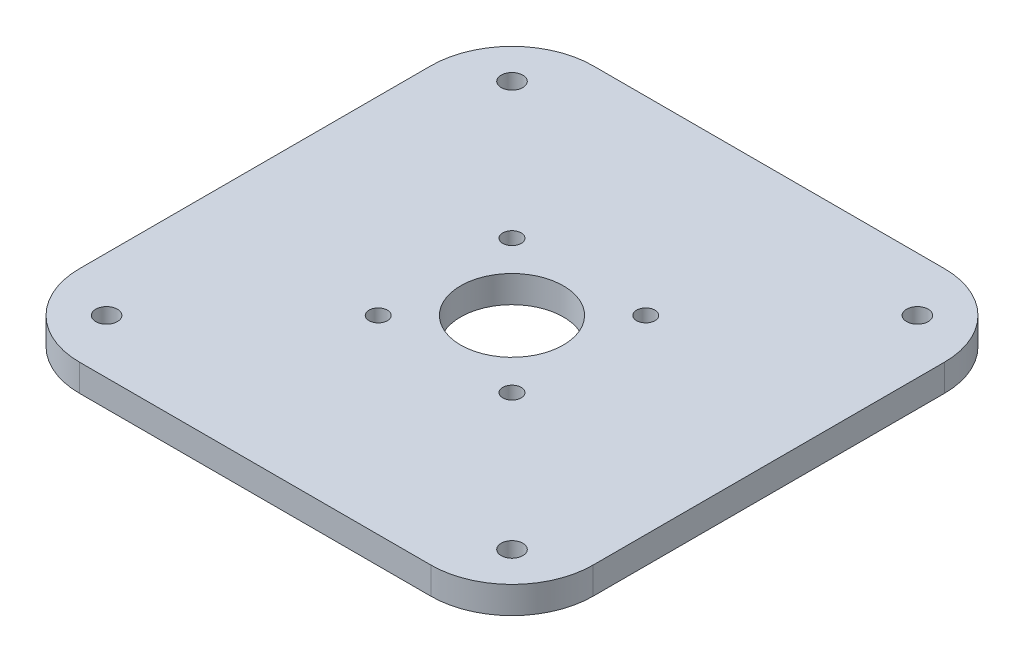
ISO-10303-21;
HEADER;
FILE_DESCRIPTION(('STEP AP214'),'2;1');
FILE_NAME('part.step','',(''),(''),'','','');
FILE_SCHEMA(('AUTOMOTIVE_DESIGN { 1 0 10303 214 1 1 1 1 }'));
ENDSEC;
DATA;
#1=APPLICATION_CONTEXT('core data for automotive mechanical design processes');
#2=APPLICATION_PROTOCOL_DEFINITION('international standard','automotive_design',2000,#1);
#3=PRODUCT_CONTEXT('',#1,'mechanical');
#4=PRODUCT('Part','Part','',(#3));
#5=PRODUCT_RELATED_PRODUCT_CATEGORY('part','',(#4));
#6=PRODUCT_DEFINITION_FORMATION('','',#4);
#7=PRODUCT_DEFINITION_CONTEXT('part definition',#1,'design');
#8=PRODUCT_DEFINITION('design','',#6,#7);
#9=PRODUCT_DEFINITION_SHAPE('','',#8);
#10=(LENGTH_UNIT() NAMED_UNIT(*) SI_UNIT(.MILLI.,.METRE.));
#11=(NAMED_UNIT(*) PLANE_ANGLE_UNIT() SI_UNIT($,.RADIAN.));
#12=(NAMED_UNIT(*) SI_UNIT($,.STERADIAN.) SOLID_ANGLE_UNIT());
#13=UNCERTAINTY_MEASURE_WITH_UNIT(LENGTH_MEASURE(1.E-05),#10,'distance_accuracy_value','');
#14=(GEOMETRIC_REPRESENTATION_CONTEXT(3) GLOBAL_UNCERTAINTY_ASSIGNED_CONTEXT((#13)) GLOBAL_UNIT_ASSIGNED_CONTEXT((#10,
#11,#12)) REPRESENTATION_CONTEXT('',''));
#15=CARTESIAN_POINT('',(0.,0.,0.));
#16=DIRECTION('',(0.,0.,1.));
#17=DIRECTION('',(1.,0.,0.));
#18=AXIS2_PLACEMENT_3D('',#15,#16,#17);
#19=CARTESIAN_POINT('',(-95.,10.,95.));
#20=DIRECTION('',(1.,0.,0.));
#21=DIRECTION('',(0.,0.,-1.));
#22=AXIS2_PLACEMENT_3D('',#19,#20,#21);
#23=PLANE('',#22);
#24=DIRECTION('',(0.,0.,1.));
#25=VECTOR('',#24,1.);
#26=CARTESIAN_POINT('',(-95.,0.,95.));
#27=LINE('',#26,#25);
#28=CARTESIAN_POINT('',(-95.,0.,-65.));
#29=VERTEX_POINT('',#28);
#30=CARTESIAN_POINT('',(-95.,0.,65.));
#31=VERTEX_POINT('',#30);
#32=EDGE_CURVE('E130',#29,#31,#27,.T.);
#33=ORIENTED_EDGE('',*,*,#32,.T.);
#34=DIRECTION('',(0.,-1.,0.));
#35=VECTOR('',#34,1.);
#36=CARTESIAN_POINT('',(-95.,10.,65.));
#37=LINE('',#36,#35);
#38=CARTESIAN_POINT('',(-95.,10.,65.));
#39=VERTEX_POINT('',#38);
#40=EDGE_CURVE('E108',#31,#39,#37,.F.);
#41=ORIENTED_EDGE('',*,*,#40,.T.);
#42=DIRECTION('',(0.,0.,1.));
#43=VECTOR('',#42,1.);
#44=CARTESIAN_POINT('',(-95.,10.,95.));
#45=LINE('',#44,#43);
#46=CARTESIAN_POINT('',(-95.,10.,-65.));
#47=VERTEX_POINT('',#46);
#48=EDGE_CURVE('E140',#47,#39,#45,.T.);
#49=ORIENTED_EDGE('',*,*,#48,.F.);
#50=DIRECTION('',(0.,-1.,0.));
#51=VECTOR('',#50,1.);
#52=CARTESIAN_POINT('',(-95.,10.,-65.));
#53=LINE('',#52,#51);
#54=EDGE_CURVE('E113',#47,#29,#53,.T.);
#55=ORIENTED_EDGE('',*,*,#54,.T.);
#56=EDGE_LOOP('',(#33,#41,#49,#55));
#57=FACE_BOUND('',#56,.T.);
#58=ADVANCED_FACE('F35',(#57),#23,.F.);
#59=CARTESIAN_POINT('',(95.,10.,94.9999999999999));
#60=DIRECTION('',(0.,0.,-1.));
#61=DIRECTION('',(-1.,0.,0.));
#62=AXIS2_PLACEMENT_3D('',#59,#60,#61);
#63=PLANE('',#62);
#64=DIRECTION('',(1.,0.,0.));
#65=VECTOR('',#64,1.);
#66=CARTESIAN_POINT('',(95.,10.,94.9999999999999));
#67=LINE('',#66,#65);
#68=CARTESIAN_POINT('',(-65.,10.,95.));
#69=VERTEX_POINT('',#68);
#70=CARTESIAN_POINT('',(65.,10.,94.9999999999999));
#71=VERTEX_POINT('',#70);
#72=EDGE_CURVE('E123',#69,#71,#67,.T.);
#73=ORIENTED_EDGE('',*,*,#72,.F.);
#74=DIRECTION('',(0.,-1.,0.));
#75=VECTOR('',#74,1.);
#76=CARTESIAN_POINT('',(-65.,10.,95.));
#77=LINE('',#76,#75);
#78=CARTESIAN_POINT('',(-65.,0.,95.));
#79=VERTEX_POINT('',#78);
#80=EDGE_CURVE('E107',#69,#79,#77,.T.);
#81=ORIENTED_EDGE('',*,*,#80,.T.);
#82=DIRECTION('',(1.,0.,0.));
#83=VECTOR('',#82,1.);
#84=CARTESIAN_POINT('',(95.,0.,94.9999999999999));
#85=LINE('',#84,#83);
#86=CARTESIAN_POINT('',(65.,0.,94.9999999999999));
#87=VERTEX_POINT('',#86);
#88=EDGE_CURVE('E120',#79,#87,#85,.T.);
#89=ORIENTED_EDGE('',*,*,#88,.T.);
#90=DIRECTION('',(0.,-1.,0.));
#91=VECTOR('',#90,1.);
#92=CARTESIAN_POINT('',(65.,10.,94.9999999999999));
#93=LINE('',#92,#91);
#94=EDGE_CURVE('E125',#87,#71,#93,.F.);
#95=ORIENTED_EDGE('',*,*,#94,.T.);
#96=EDGE_LOOP('',(#73,#81,#89,#95));
#97=FACE_BOUND('',#96,.T.);
#98=ADVANCED_FACE('F119',(#97),#63,.F.);
#99=CARTESIAN_POINT('',(95.,10.,94.9999999999999));
#100=DIRECTION('',(-1.,0.,0.));
#101=DIRECTION('',(0.,0.,1.));
#102=AXIS2_PLACEMENT_3D('',#99,#100,#101);
#103=PLANE('',#102);
#104=DIRECTION('',(0.,0.,-1.));
#105=VECTOR('',#104,1.);
#106=CARTESIAN_POINT('',(95.,10.,94.9999999999999));
#107=LINE('',#106,#105);
#108=CARTESIAN_POINT('',(95.,10.,64.9999999999999));
#109=VERTEX_POINT('',#108);
#110=CARTESIAN_POINT('',(95.,10.,-65.0000000000001));
#111=VERTEX_POINT('',#110);
#112=EDGE_CURVE('E219',#109,#111,#107,.T.);
#113=ORIENTED_EDGE('',*,*,#112,.F.);
#114=DIRECTION('',(0.,-1.,0.));
#115=VECTOR('',#114,1.);
#116=CARTESIAN_POINT('',(95.,10.,64.9999999999999));
#117=LINE('',#116,#115);
#118=CARTESIAN_POINT('',(95.,0.,64.9999999999999));
#119=VERTEX_POINT('',#118);
#120=EDGE_CURVE('E159',#109,#119,#117,.T.);
#121=ORIENTED_EDGE('',*,*,#120,.T.);
#122=DIRECTION('',(0.,0.,-1.));
#123=VECTOR('',#122,1.);
#124=CARTESIAN_POINT('',(95.,0.,94.9999999999999));
#125=LINE('',#124,#123);
#126=CARTESIAN_POINT('',(95.,0.,-65.0000000000001));
#127=VERTEX_POINT('',#126);
#128=EDGE_CURVE('E129',#119,#127,#125,.T.);
#129=ORIENTED_EDGE('',*,*,#128,.T.);
#130=DIRECTION('',(0.,-1.,0.));
#131=VECTOR('',#130,1.);
#132=CARTESIAN_POINT('',(95.,10.,-65.0000000000001));
#133=LINE('',#132,#131);
#134=EDGE_CURVE('E157',#127,#111,#133,.F.);
#135=ORIENTED_EDGE('',*,*,#134,.T.);
#136=EDGE_LOOP('',(#113,#121,#129,#135));
#137=FACE_BOUND('',#136,.T.);
#138=ADVANCED_FACE('F234',(#137),#103,.F.);
#139=CARTESIAN_POINT('',(95.,10.,-95.0000000000001));
#140=DIRECTION('',(0.,0.,1.));
#141=DIRECTION('',(1.,0.,0.));
#142=AXIS2_PLACEMENT_3D('',#139,#140,#141);
#143=PLANE('',#142);
#144=DIRECTION('',(-1.,0.,0.));
#145=VECTOR('',#144,1.);
#146=CARTESIAN_POINT('',(95.,10.,-95.0000000000001));
#147=LINE('',#146,#145);
#148=CARTESIAN_POINT('',(65.,10.,-95.0000000000001));
#149=VERTEX_POINT('',#148);
#150=CARTESIAN_POINT('',(-65.,10.,-95.));
#151=VERTEX_POINT('',#150);
#152=EDGE_CURVE('E141',#149,#151,#147,.T.);
#153=ORIENTED_EDGE('',*,*,#152,.F.);
#154=DIRECTION('',(0.,-1.,0.));
#155=VECTOR('',#154,1.);
#156=CARTESIAN_POINT('',(65.,10.,-95.0000000000001));
#157=LINE('',#156,#155);
#158=CARTESIAN_POINT('',(65.,0.,-95.0000000000001));
#159=VERTEX_POINT('',#158);
#160=EDGE_CURVE('E11',#149,#159,#157,.T.);
#161=ORIENTED_EDGE('',*,*,#160,.T.);
#162=DIRECTION('',(-1.,0.,0.));
#163=VECTOR('',#162,1.);
#164=CARTESIAN_POINT('',(95.,0.,-95.0000000000001));
#165=LINE('',#164,#163);
#166=CARTESIAN_POINT('',(-65.,0.,-95.));
#167=VERTEX_POINT('',#166);
#168=EDGE_CURVE('E133',#159,#167,#165,.T.);
#169=ORIENTED_EDGE('',*,*,#168,.T.);
#170=DIRECTION('',(0.,-1.,0.));
#171=VECTOR('',#170,1.);
#172=CARTESIAN_POINT('',(-65.,10.,-95.));
#173=LINE('',#172,#171);
#174=EDGE_CURVE('E44',#167,#151,#173,.F.);
#175=ORIENTED_EDGE('',*,*,#174,.T.);
#176=EDGE_LOOP('',(#153,#161,#169,#175));
#177=FACE_BOUND('',#176,.T.);
#178=ADVANCED_FACE('F228',(#177),#143,.F.);
#179=CARTESIAN_POINT('',(0.,10.,0.));
#180=DIRECTION('',(0.,1.,0.));
#181=DIRECTION('',(0.,0.,1.));
#182=AXIS2_PLACEMENT_3D('',#179,#180,#181);
#183=PLANE('',#182);
#184=CARTESIAN_POINT('',(-24.7487373415292,10.,-24.7487373415292));
#185=DIRECTION('',(0.,1.,0.));
#186=DIRECTION('',(0.,0.,1.));
#187=AXIS2_PLACEMENT_3D('',#184,#185,#186);
#188=CIRCLE('',#187,3.39999999999999);
#189=CARTESIAN_POINT('',(-24.7487373415292,10.,-21.3487373415292));
#190=VERTEX_POINT('',#189);
#191=EDGE_CURVE('E179',#190,#190,#188,.T.);
#192=ORIENTED_EDGE('',*,*,#191,.F.);
#193=EDGE_LOOP('',(#192));
#194=FACE_BOUND('',#193,.T.);
#195=CARTESIAN_POINT('',(24.7487373415292,10.,-24.7487373415292));
#196=DIRECTION('',(0.,1.,0.));
#197=DIRECTION('',(0.,0.,1.));
#198=AXIS2_PLACEMENT_3D('',#195,#196,#197);
#199=CIRCLE('',#198,3.39999999999999);
#200=CARTESIAN_POINT('',(24.7487373415292,10.,-21.3487373415292));
#201=VERTEX_POINT('',#200);
#202=EDGE_CURVE('E169',#201,#201,#199,.T.);
#203=ORIENTED_EDGE('',*,*,#202,.F.);
#204=EDGE_LOOP('',(#203));
#205=FACE_BOUND('',#204,.T.);
#206=CARTESIAN_POINT('',(-24.7487373415292,10.,24.7487373415292));
#207=DIRECTION('',(0.,1.,0.));
#208=DIRECTION('',(0.,0.,1.));
#209=AXIS2_PLACEMENT_3D('',#206,#207,#208);
#210=CIRCLE('',#209,3.39999999999999);
#211=CARTESIAN_POINT('',(-24.7487373415292,10.,28.1487373415291));
#212=VERTEX_POINT('',#211);
#213=EDGE_CURVE('E166',#212,#212,#210,.T.);
#214=ORIENTED_EDGE('',*,*,#213,.F.);
#215=EDGE_LOOP('',(#214));
#216=FACE_BOUND('',#215,.T.);
#217=CARTESIAN_POINT('',(24.7487373415292,10.,24.7487373415292));
#218=DIRECTION('',(0.,1.,0.));
#219=DIRECTION('',(0.,0.,1.));
#220=AXIS2_PLACEMENT_3D('',#217,#218,#219);
#221=CIRCLE('',#220,3.39999999999999);
#222=CARTESIAN_POINT('',(24.7487373415292,10.,28.1487373415291));
#223=VERTEX_POINT('',#222);
#224=EDGE_CURVE('E165',#223,#223,#221,.T.);
#225=ORIENTED_EDGE('',*,*,#224,.F.);
#226=EDGE_LOOP('',(#225));
#227=FACE_BOUND('',#226,.T.);
#228=CARTESIAN_POINT('',(-75.,10.,75.));
#229=DIRECTION('',(0.,1.,0.));
#230=DIRECTION('',(0.,0.,-1.));
#231=AXIS2_PLACEMENT_3D('',#228,#229,#230);
#232=CIRCLE('',#231,4.00000000000001);
#233=CARTESIAN_POINT('',(-75.,10.,71.));
#234=VERTEX_POINT('',#233);
#235=EDGE_CURVE('E187',#234,#234,#232,.T.);
#236=ORIENTED_EDGE('',*,*,#235,.F.);
#237=EDGE_LOOP('',(#236));
#238=FACE_BOUND('',#237,.T.);
#239=CARTESIAN_POINT('',(75.,10.,75.));
#240=DIRECTION('',(0.,1.,0.));
#241=DIRECTION('',(0.,0.,1.));
#242=AXIS2_PLACEMENT_3D('',#239,#240,#241);
#243=CIRCLE('',#242,4.00000000000001);
#244=CARTESIAN_POINT('',(75.,10.,79.));
#245=VERTEX_POINT('',#244);
#246=EDGE_CURVE('E204',#245,#245,#243,.T.);
#247=ORIENTED_EDGE('',*,*,#246,.F.);
#248=EDGE_LOOP('',(#247));
#249=FACE_BOUND('',#248,.T.);
#250=CARTESIAN_POINT('',(75.,10.,-75.));
#251=DIRECTION('',(0.,1.,0.));
#252=DIRECTION('',(0.,0.,-1.));
#253=AXIS2_PLACEMENT_3D('',#250,#251,#252);
#254=CIRCLE('',#253,4.00000000000001);
#255=CARTESIAN_POINT('',(75.,10.,-79.));
#256=VERTEX_POINT('',#255);
#257=EDGE_CURVE('E198',#256,#256,#254,.T.);
#258=ORIENTED_EDGE('',*,*,#257,.F.);
#259=EDGE_LOOP('',(#258));
#260=FACE_BOUND('',#259,.T.);
#261=CARTESIAN_POINT('',(-75.,10.,-75.));
#262=DIRECTION('',(0.,1.,0.));
#263=DIRECTION('',(0.,0.,1.));
#264=AXIS2_PLACEMENT_3D('',#261,#262,#263);
#265=CIRCLE('',#264,4.00000000000001);
#266=CARTESIAN_POINT('',(-75.,10.,-71.));
#267=VERTEX_POINT('',#266);
#268=EDGE_CURVE('E192',#267,#267,#265,.T.);
#269=ORIENTED_EDGE('',*,*,#268,.F.);
#270=EDGE_LOOP('',(#269));
#271=FACE_BOUND('',#270,.T.);
#272=CARTESIAN_POINT('',(0.,10.,0.));
#273=DIRECTION('',(0.,1.,0.));
#274=DIRECTION('',(0.,0.,1.));
#275=AXIS2_PLACEMENT_3D('',#272,#273,#274);
#276=CIRCLE('',#275,19.);
#277=CARTESIAN_POINT('',(0.,10.,19.));
#278=VERTEX_POINT('',#277);
#279=EDGE_CURVE('E191',#278,#278,#276,.T.);
#280=ORIENTED_EDGE('',*,*,#279,.F.);
#281=EDGE_LOOP('',(#280));
#282=FACE_BOUND('',#281,.T.);
#283=ORIENTED_EDGE('',*,*,#48,.T.);
#284=CARTESIAN_POINT('',(-65.,10.,65.));
#285=DIRECTION('',(0.,1.,0.));
#286=DIRECTION('',(0.,0.,1.));
#287=AXIS2_PLACEMENT_3D('',#284,#285,#286);
#288=CIRCLE('',#287,30.);
#289=EDGE_CURVE('E155',#39,#69,#288,.T.);
#290=ORIENTED_EDGE('',*,*,#289,.T.);
#291=ORIENTED_EDGE('',*,*,#72,.T.);
#292=CARTESIAN_POINT('',(65.,10.,64.9999999999999));
#293=DIRECTION('',(0.,1.,0.));
#294=DIRECTION('',(0.,0.,1.));
#295=AXIS2_PLACEMENT_3D('',#292,#293,#294);
#296=CIRCLE('',#295,30.);
#297=EDGE_CURVE('E153',#71,#109,#296,.T.);
#298=ORIENTED_EDGE('',*,*,#297,.T.);
#299=ORIENTED_EDGE('',*,*,#112,.T.);
#300=CARTESIAN_POINT('',(65.,10.,-65.0000000000001));
#301=DIRECTION('',(0.,1.,0.));
#302=DIRECTION('',(0.,0.,1.));
#303=AXIS2_PLACEMENT_3D('',#300,#301,#302);
#304=CIRCLE('',#303,30.);
#305=EDGE_CURVE('E58',#111,#149,#304,.T.);
#306=ORIENTED_EDGE('',*,*,#305,.T.);
#307=ORIENTED_EDGE('',*,*,#152,.T.);
#308=CARTESIAN_POINT('',(-65.,10.,-65.));
#309=DIRECTION('',(0.,1.,0.));
#310=DIRECTION('',(0.,0.,1.));
#311=AXIS2_PLACEMENT_3D('',#308,#309,#310);
#312=CIRCLE('',#311,30.);
#313=EDGE_CURVE('E150',#151,#47,#312,.T.);
#314=ORIENTED_EDGE('',*,*,#313,.T.);
#315=EDGE_LOOP('',(#283,#290,#291,#298,#299,#306,#307,#314));
#316=FACE_BOUND('',#315,.T.);
#317=ADVANCED_FACE('F221',(#194,#205,#216,#227,#238,#249,#260,#271,#282,#316),#183,.T.);
#318=CARTESIAN_POINT('',(0.,0.,0.));
#319=DIRECTION('',(0.,1.,0.));
#320=DIRECTION('',(0.,0.,1.));
#321=AXIS2_PLACEMENT_3D('',#318,#319,#320);
#322=PLANE('',#321);
#323=CARTESIAN_POINT('',(-24.7487373415292,0.,-24.7487373415292));
#324=DIRECTION('',(0.,1.,0.));
#325=DIRECTION('',(0.,0.,1.));
#326=AXIS2_PLACEMENT_3D('',#323,#324,#325);
#327=CIRCLE('',#326,3.39999999999999);
#328=CARTESIAN_POINT('',(-24.7487373415292,0.,-21.3487373415292));
#329=VERTEX_POINT('',#328);
#330=EDGE_CURVE('E39',#329,#329,#327,.T.);
#331=ORIENTED_EDGE('',*,*,#330,.T.);
#332=EDGE_LOOP('',(#331));
#333=FACE_BOUND('',#332,.T.);
#334=CARTESIAN_POINT('',(24.7487373415292,0.,-24.7487373415292));
#335=DIRECTION('',(0.,1.,0.));
#336=DIRECTION('',(0.,0.,1.));
#337=AXIS2_PLACEMENT_3D('',#334,#335,#336);
#338=CIRCLE('',#337,3.39999999999999);
#339=CARTESIAN_POINT('',(24.7487373415292,0.,-21.3487373415292));
#340=VERTEX_POINT('',#339);
#341=EDGE_CURVE('E167',#340,#340,#338,.T.);
#342=ORIENTED_EDGE('',*,*,#341,.T.);
#343=EDGE_LOOP('',(#342));
#344=FACE_BOUND('',#343,.T.);
#345=CARTESIAN_POINT('',(-24.7487373415292,0.,24.7487373415292));
#346=DIRECTION('',(0.,1.,0.));
#347=DIRECTION('',(0.,0.,1.));
#348=AXIS2_PLACEMENT_3D('',#345,#346,#347);
#349=CIRCLE('',#348,3.39999999999999);
#350=CARTESIAN_POINT('',(-24.7487373415292,0.,28.1487373415291));
#351=VERTEX_POINT('',#350);
#352=EDGE_CURVE('E163',#351,#351,#349,.T.);
#353=ORIENTED_EDGE('',*,*,#352,.T.);
#354=EDGE_LOOP('',(#353));
#355=FACE_BOUND('',#354,.T.);
#356=CARTESIAN_POINT('',(24.7487373415292,0.,24.7487373415292));
#357=DIRECTION('',(0.,1.,0.));
#358=DIRECTION('',(0.,0.,1.));
#359=AXIS2_PLACEMENT_3D('',#356,#357,#358);
#360=CIRCLE('',#359,3.39999999999999);
#361=CARTESIAN_POINT('',(24.7487373415292,0.,28.1487373415291));
#362=VERTEX_POINT('',#361);
#363=EDGE_CURVE('E184',#362,#362,#360,.T.);
#364=ORIENTED_EDGE('',*,*,#363,.T.);
#365=EDGE_LOOP('',(#364));
#366=FACE_BOUND('',#365,.T.);
#367=CARTESIAN_POINT('',(-75.,0.,75.));
#368=DIRECTION('',(0.,1.,0.));
#369=DIRECTION('',(0.,0.,-1.));
#370=AXIS2_PLACEMENT_3D('',#367,#368,#369);
#371=CIRCLE('',#370,4.00000000000001);
#372=CARTESIAN_POINT('',(-75.,0.,71.));
#373=VERTEX_POINT('',#372);
#374=EDGE_CURVE('E207',#373,#373,#371,.T.);
#375=ORIENTED_EDGE('',*,*,#374,.T.);
#376=EDGE_LOOP('',(#375));
#377=FACE_BOUND('',#376,.T.);
#378=CARTESIAN_POINT('',(75.,0.,75.));
#379=DIRECTION('',(0.,1.,0.));
#380=DIRECTION('',(0.,0.,1.));
#381=AXIS2_PLACEMENT_3D('',#378,#379,#380);
#382=CIRCLE('',#381,4.00000000000001);
#383=CARTESIAN_POINT('',(75.,0.,79.));
#384=VERTEX_POINT('',#383);
#385=EDGE_CURVE('E201',#384,#384,#382,.T.);
#386=ORIENTED_EDGE('',*,*,#385,.T.);
#387=EDGE_LOOP('',(#386));
#388=FACE_BOUND('',#387,.T.);
#389=CARTESIAN_POINT('',(75.,0.,-75.));
#390=DIRECTION('',(0.,1.,0.));
#391=DIRECTION('',(0.,0.,-1.));
#392=AXIS2_PLACEMENT_3D('',#389,#390,#391);
#393=CIRCLE('',#392,4.00000000000001);
#394=CARTESIAN_POINT('',(75.,0.,-79.));
#395=VERTEX_POINT('',#394);
#396=EDGE_CURVE('E195',#395,#395,#393,.T.);
#397=ORIENTED_EDGE('',*,*,#396,.T.);
#398=EDGE_LOOP('',(#397));
#399=FACE_BOUND('',#398,.T.);
#400=CARTESIAN_POINT('',(-75.,0.,-75.));
#401=DIRECTION('',(0.,1.,0.));
#402=DIRECTION('',(0.,0.,1.));
#403=AXIS2_PLACEMENT_3D('',#400,#401,#402);
#404=CIRCLE('',#403,4.00000000000001);
#405=CARTESIAN_POINT('',(-75.,0.,-71.));
#406=VERTEX_POINT('',#405);
#407=EDGE_CURVE('E188',#406,#406,#404,.T.);
#408=ORIENTED_EDGE('',*,*,#407,.T.);
#409=EDGE_LOOP('',(#408));
#410=FACE_BOUND('',#409,.T.);
#411=CARTESIAN_POINT('',(0.,0.,0.));
#412=DIRECTION('',(0.,1.,0.));
#413=DIRECTION('',(0.,0.,1.));
#414=AXIS2_PLACEMENT_3D('',#411,#412,#413);
#415=CIRCLE('',#414,19.);
#416=CARTESIAN_POINT('',(0.,0.,19.));
#417=VERTEX_POINT('',#416);
#418=EDGE_CURVE('E135',#417,#417,#415,.T.);
#419=ORIENTED_EDGE('',*,*,#418,.T.);
#420=EDGE_LOOP('',(#419));
#421=FACE_BOUND('',#420,.T.);
#422=ORIENTED_EDGE('',*,*,#88,.F.);
#423=CARTESIAN_POINT('',(-65.,0.,65.));
#424=DIRECTION('',(0.,1.,0.));
#425=DIRECTION('',(0.,0.,1.));
#426=AXIS2_PLACEMENT_3D('',#423,#424,#425);
#427=CIRCLE('',#426,30.);
#428=EDGE_CURVE('E103',#79,#31,#427,.F.);
#429=ORIENTED_EDGE('',*,*,#428,.T.);
#430=ORIENTED_EDGE('',*,*,#32,.F.);
#431=CARTESIAN_POINT('',(-65.,0.,-65.));
#432=DIRECTION('',(0.,1.,0.));
#433=DIRECTION('',(0.,0.,1.));
#434=AXIS2_PLACEMENT_3D('',#431,#432,#433);
#435=CIRCLE('',#434,30.);
#436=EDGE_CURVE('E124',#29,#167,#435,.F.);
#437=ORIENTED_EDGE('',*,*,#436,.T.);
#438=ORIENTED_EDGE('',*,*,#168,.F.);
#439=CARTESIAN_POINT('',(65.,0.,-65.0000000000001));
#440=DIRECTION('',(0.,1.,0.));
#441=DIRECTION('',(0.,0.,1.));
#442=AXIS2_PLACEMENT_3D('',#439,#440,#441);
#443=CIRCLE('',#442,30.);
#444=EDGE_CURVE('E144',#159,#127,#443,.F.);
#445=ORIENTED_EDGE('',*,*,#444,.T.);
#446=ORIENTED_EDGE('',*,*,#128,.F.);
#447=CARTESIAN_POINT('',(65.,0.,64.9999999999999));
#448=DIRECTION('',(0.,1.,0.));
#449=DIRECTION('',(0.,0.,1.));
#450=AXIS2_PLACEMENT_3D('',#447,#448,#449);
#451=CIRCLE('',#450,30.);
#452=EDGE_CURVE('E114',#119,#87,#451,.F.);
#453=ORIENTED_EDGE('',*,*,#452,.T.);
#454=EDGE_LOOP('',(#422,#429,#430,#437,#438,#445,#446,#453));
#455=FACE_BOUND('',#454,.T.);
#456=ADVANCED_FACE('F127',(#333,#344,#355,#366,#377,#388,#399,#410,#421,#455),#322,.F.);
#457=CARTESIAN_POINT('',(0.,0.,0.));
#458=DIRECTION('',(0.,1.,0.));
#459=DIRECTION('',(0.,0.,1.));
#460=AXIS2_PLACEMENT_3D('',#457,#458,#459);
#461=CYLINDRICAL_SURFACE('',#460,19.);
#462=ORIENTED_EDGE('',*,*,#418,.F.);
#463=EDGE_LOOP('',(#462));
#464=FACE_BOUND('',#463,.T.);
#465=ORIENTED_EDGE('',*,*,#279,.T.);
#466=EDGE_LOOP('',(#465));
#467=FACE_BOUND('',#466,.T.);
#468=ADVANCED_FACE('F260',(#464,#467),#461,.F.);
#469=CARTESIAN_POINT('',(-75.,0.,-75.));
#470=DIRECTION('',(0.,1.,0.));
#471=DIRECTION('',(0.,0.,1.));
#472=AXIS2_PLACEMENT_3D('',#469,#470,#471);
#473=CYLINDRICAL_SURFACE('',#472,4.00000000000001);
#474=ORIENTED_EDGE('',*,*,#407,.F.);
#475=EDGE_LOOP('',(#474));
#476=FACE_BOUND('',#475,.T.);
#477=ORIENTED_EDGE('',*,*,#268,.T.);
#478=EDGE_LOOP('',(#477));
#479=FACE_BOUND('',#478,.T.);
#480=ADVANCED_FACE('F267',(#476,#479),#473,.F.);
#481=CARTESIAN_POINT('',(75.,0.,-75.));
#482=DIRECTION('',(0.,1.,0.));
#483=DIRECTION('',(0.,0.,1.));
#484=AXIS2_PLACEMENT_3D('',#481,#482,#483);
#485=CYLINDRICAL_SURFACE('',#484,4.00000000000001);
#486=ORIENTED_EDGE('',*,*,#396,.F.);
#487=EDGE_LOOP('',(#486));
#488=FACE_BOUND('',#487,.T.);
#489=ORIENTED_EDGE('',*,*,#257,.T.);
#490=EDGE_LOOP('',(#489));
#491=FACE_BOUND('',#490,.T.);
#492=ADVANCED_FACE('F275',(#488,#491),#485,.F.);
#493=CARTESIAN_POINT('',(75.,0.,75.));
#494=DIRECTION('',(0.,1.,0.));
#495=DIRECTION('',(0.,0.,1.));
#496=AXIS2_PLACEMENT_3D('',#493,#494,#495);
#497=CYLINDRICAL_SURFACE('',#496,4.00000000000001);
#498=ORIENTED_EDGE('',*,*,#385,.F.);
#499=EDGE_LOOP('',(#498));
#500=FACE_BOUND('',#499,.T.);
#501=ORIENTED_EDGE('',*,*,#246,.T.);
#502=EDGE_LOOP('',(#501));
#503=FACE_BOUND('',#502,.T.);
#504=ADVANCED_FACE('F271',(#500,#503),#497,.F.);
#505=CARTESIAN_POINT('',(-75.,0.,75.));
#506=DIRECTION('',(0.,1.,0.));
#507=DIRECTION('',(0.,0.,1.));
#508=AXIS2_PLACEMENT_3D('',#505,#506,#507);
#509=CYLINDRICAL_SURFACE('',#508,4.00000000000001);
#510=ORIENTED_EDGE('',*,*,#374,.F.);
#511=EDGE_LOOP('',(#510));
#512=FACE_BOUND('',#511,.T.);
#513=ORIENTED_EDGE('',*,*,#235,.T.);
#514=EDGE_LOOP('',(#513));
#515=FACE_BOUND('',#514,.T.);
#516=ADVANCED_FACE('F245',(#512,#515),#509,.F.);
#517=CARTESIAN_POINT('',(-65.,10.,65.));
#518=DIRECTION('',(0.,-1.,0.));
#519=DIRECTION('',(0.,0.,-1.));
#520=AXIS2_PLACEMENT_3D('',#517,#518,#519);
#521=CYLINDRICAL_SURFACE('',#520,30.);
#522=ORIENTED_EDGE('',*,*,#289,.F.);
#523=ORIENTED_EDGE('',*,*,#40,.F.);
#524=ORIENTED_EDGE('',*,*,#428,.F.);
#525=ORIENTED_EDGE('',*,*,#80,.F.);
#526=EDGE_LOOP('',(#522,#523,#524,#525));
#527=FACE_BOUND('',#526,.T.);
#528=ADVANCED_FACE('F106',(#527),#521,.T.);
#529=CARTESIAN_POINT('',(65.,10.,64.9999999999999));
#530=DIRECTION('',(0.,-1.,0.));
#531=DIRECTION('',(0.,0.,-1.));
#532=AXIS2_PLACEMENT_3D('',#529,#530,#531);
#533=CYLINDRICAL_SURFACE('',#532,30.);
#534=ORIENTED_EDGE('',*,*,#297,.F.);
#535=ORIENTED_EDGE('',*,*,#94,.F.);
#536=ORIENTED_EDGE('',*,*,#452,.F.);
#537=ORIENTED_EDGE('',*,*,#120,.F.);
#538=EDGE_LOOP('',(#534,#535,#536,#537));
#539=FACE_BOUND('',#538,.T.);
#540=ADVANCED_FACE('F238',(#539),#533,.T.);
#541=CARTESIAN_POINT('',(65.,10.,-65.0000000000001));
#542=DIRECTION('',(0.,-1.,0.));
#543=DIRECTION('',(0.,0.,-1.));
#544=AXIS2_PLACEMENT_3D('',#541,#542,#543);
#545=CYLINDRICAL_SURFACE('',#544,30.);
#546=ORIENTED_EDGE('',*,*,#305,.F.);
#547=ORIENTED_EDGE('',*,*,#134,.F.);
#548=ORIENTED_EDGE('',*,*,#444,.F.);
#549=ORIENTED_EDGE('',*,*,#160,.F.);
#550=EDGE_LOOP('',(#546,#547,#548,#549));
#551=FACE_BOUND('',#550,.T.);
#552=ADVANCED_FACE('F230',(#551),#545,.T.);
#553=CARTESIAN_POINT('',(-65.,10.,-65.));
#554=DIRECTION('',(0.,-1.,0.));
#555=DIRECTION('',(0.,0.,-1.));
#556=AXIS2_PLACEMENT_3D('',#553,#554,#555);
#557=CYLINDRICAL_SURFACE('',#556,30.);
#558=ORIENTED_EDGE('',*,*,#313,.F.);
#559=ORIENTED_EDGE('',*,*,#174,.F.);
#560=ORIENTED_EDGE('',*,*,#436,.F.);
#561=ORIENTED_EDGE('',*,*,#54,.F.);
#562=EDGE_LOOP('',(#558,#559,#560,#561));
#563=FACE_BOUND('',#562,.T.);
#564=ADVANCED_FACE('F37',(#563),#557,.T.);
#565=CARTESIAN_POINT('',(24.7487373415292,10.,24.7487373415292));
#566=DIRECTION('',(0.,1.,0.));
#567=DIRECTION('',(0.,0.,1.));
#568=AXIS2_PLACEMENT_3D('',#565,#566,#567);
#569=CYLINDRICAL_SURFACE('',#568,3.39999999999999);
#570=ORIENTED_EDGE('',*,*,#224,.T.);
#571=EDGE_LOOP('',(#570));
#572=FACE_BOUND('',#571,.T.);
#573=ORIENTED_EDGE('',*,*,#363,.F.);
#574=EDGE_LOOP('',(#573));
#575=FACE_BOUND('',#574,.T.);
#576=ADVANCED_FACE('F283',(#572,#575),#569,.F.);
#577=CARTESIAN_POINT('',(-24.7487373415292,10.,24.7487373415292));
#578=DIRECTION('',(0.,1.,0.));
#579=DIRECTION('',(0.,0.,1.));
#580=AXIS2_PLACEMENT_3D('',#577,#578,#579);
#581=CYLINDRICAL_SURFACE('',#580,3.39999999999999);
#582=ORIENTED_EDGE('',*,*,#213,.T.);
#583=EDGE_LOOP('',(#582));
#584=FACE_BOUND('',#583,.T.);
#585=ORIENTED_EDGE('',*,*,#352,.F.);
#586=EDGE_LOOP('',(#585));
#587=FACE_BOUND('',#586,.T.);
#588=ADVANCED_FACE('F286',(#584,#587),#581,.F.);
#589=CARTESIAN_POINT('',(24.7487373415292,10.,-24.7487373415292));
#590=DIRECTION('',(0.,1.,0.));
#591=DIRECTION('',(0.,0.,1.));
#592=AXIS2_PLACEMENT_3D('',#589,#590,#591);
#593=CYLINDRICAL_SURFACE('',#592,3.39999999999999);
#594=ORIENTED_EDGE('',*,*,#202,.T.);
#595=EDGE_LOOP('',(#594));
#596=FACE_BOUND('',#595,.T.);
#597=ORIENTED_EDGE('',*,*,#341,.F.);
#598=EDGE_LOOP('',(#597));
#599=FACE_BOUND('',#598,.T.);
#600=ADVANCED_FACE('F290',(#596,#599),#593,.F.);
#601=CARTESIAN_POINT('',(-24.7487373415292,10.,-24.7487373415292));
#602=DIRECTION('',(0.,1.,0.));
#603=DIRECTION('',(0.,0.,1.));
#604=AXIS2_PLACEMENT_3D('',#601,#602,#603);
#605=CYLINDRICAL_SURFACE('',#604,3.39999999999999);
#606=ORIENTED_EDGE('',*,*,#191,.T.);
#607=EDGE_LOOP('',(#606));
#608=FACE_BOUND('',#607,.T.);
#609=ORIENTED_EDGE('',*,*,#330,.F.);
#610=EDGE_LOOP('',(#609));
#611=FACE_BOUND('',#610,.T.);
#612=ADVANCED_FACE('F294',(#608,#611),#605,.F.);
#613=CLOSED_SHELL('',(#58,#98,#138,#178,#317,#456,#468,#480,#492,#504,#516,#528,#540,#552,#564,
#576,#588,#600,#612));
#614=MANIFOLD_SOLID_BREP('B2',#613);
#615=ADVANCED_BREP_SHAPE_REPRESENTATION('',(#18,#614),#14);
#616=SHAPE_DEFINITION_REPRESENTATION(#9,#615);
ENDSEC;
END-ISO-10303-21;
